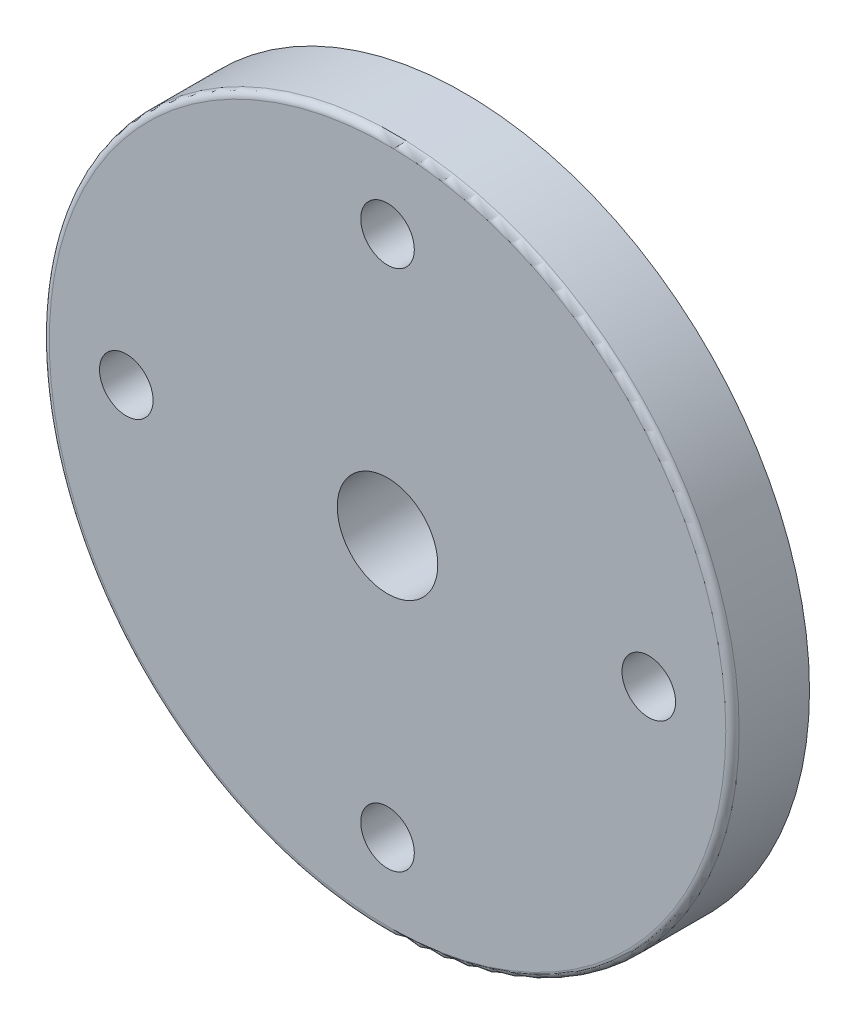
ISO-10303-21;
HEADER;
FILE_DESCRIPTION(('STEP AP214'),'2;1');
FILE_NAME('part.step','',(''),(''),'','','');
FILE_SCHEMA(('AUTOMOTIVE_DESIGN { 1 0 10303 214 1 1 1 1 }'));
ENDSEC;
DATA;
#1=APPLICATION_CONTEXT('core data for automotive mechanical design processes');
#2=APPLICATION_PROTOCOL_DEFINITION('international standard','automotive_design',2000,#1);
#3=PRODUCT_CONTEXT('',#1,'mechanical');
#4=PRODUCT('Part','Part','',(#3));
#5=PRODUCT_RELATED_PRODUCT_CATEGORY('part','',(#4));
#6=PRODUCT_DEFINITION_FORMATION('','',#4);
#7=PRODUCT_DEFINITION_CONTEXT('part definition',#1,'design');
#8=PRODUCT_DEFINITION('design','',#6,#7);
#9=PRODUCT_DEFINITION_SHAPE('','',#8);
#10=(LENGTH_UNIT() NAMED_UNIT(*) SI_UNIT(.MILLI.,.METRE.));
#11=(NAMED_UNIT(*) PLANE_ANGLE_UNIT() SI_UNIT($,.RADIAN.));
#12=(NAMED_UNIT(*) SI_UNIT($,.STERADIAN.) SOLID_ANGLE_UNIT());
#13=UNCERTAINTY_MEASURE_WITH_UNIT(LENGTH_MEASURE(1.E-05),#10,'distance_accuracy_value','');
#14=(GEOMETRIC_REPRESENTATION_CONTEXT(3) GLOBAL_UNCERTAINTY_ASSIGNED_CONTEXT((#13)) GLOBAL_UNIT_ASSIGNED_CONTEXT((#10,
#11,#12)) REPRESENTATION_CONTEXT('',''));
#15=CARTESIAN_POINT('',(0.,0.,0.));
#16=DIRECTION('',(0.,0.,1.));
#17=DIRECTION('',(1.,0.,0.));
#18=AXIS2_PLACEMENT_3D('',#15,#16,#17);
#19=CARTESIAN_POINT('',(0.,0.,-0.2));
#20=DIRECTION('',(0.,0.,-1.));
#21=DIRECTION('',(-1.,0.,0.));
#22=AXIS2_PLACEMENT_3D('',#19,#20,#21);
#23=CYLINDRICAL_SURFACE('',#22,10.3);
#24=CARTESIAN_POINT('',(0.,0.,-0.4));
#25=DIRECTION('',(0.,0.,1.));
#26=DIRECTION('',(1.,0.,0.));
#27=AXIS2_PLACEMENT_3D('',#24,#25,#26);
#28=CIRCLE('',#27,10.3);
#29=CARTESIAN_POINT('',(10.3,0.,-0.4));
#30=VERTEX_POINT('',#29);
#31=EDGE_CURVE('E49',#30,#30,#28,.F.);
#32=ORIENTED_EDGE('',*,*,#31,.T.);
#33=EDGE_LOOP('',(#32));
#34=FACE_BOUND('',#33,.T.);
#35=CARTESIAN_POINT('',(0.,0.,-2.5));
#36=DIRECTION('',(0.,0.,-1.));
#37=DIRECTION('',(1.,0.,0.));
#38=AXIS2_PLACEMENT_3D('',#35,#36,#37);
#39=CIRCLE('',#38,10.3);
#40=CARTESIAN_POINT('',(10.3,0.,-2.5));
#41=VERTEX_POINT('',#40);
#42=EDGE_CURVE('E60',#41,#41,#39,.T.);
#43=ORIENTED_EDGE('',*,*,#42,.F.);
#44=EDGE_LOOP('',(#43));
#45=FACE_BOUND('',#44,.T.);
#46=ADVANCED_FACE('F34',(#34,#45),#23,.T.);
#47=CARTESIAN_POINT('',(0.,0.,-0.2));
#48=DIRECTION('',(0.,0.,1.));
#49=DIRECTION('',(1.,0.,0.));
#50=AXIS2_PLACEMENT_3D('',#47,#48,#49);
#51=PLANE('',#50);
#52=CARTESIAN_POINT('',(0.,0.,-0.2));
#53=DIRECTION('',(0.,0.,1.));
#54=DIRECTION('',(1.,0.,0.));
#55=AXIS2_PLACEMENT_3D('',#52,#53,#54);
#56=CIRCLE('',#55,10.1);
#57=CARTESIAN_POINT('',(10.1,0.,-0.2));
#58=VERTEX_POINT('',#57);
#59=EDGE_CURVE('E45',#58,#58,#56,.T.);
#60=ORIENTED_EDGE('',*,*,#59,.T.);
#61=EDGE_LOOP('',(#60));
#62=FACE_BOUND('',#61,.T.);
#63=CARTESIAN_POINT('',(0.,7.8,-0.2));
#64=DIRECTION('',(0.,0.,-1.));
#65=DIRECTION('',(1.,0.,0.));
#66=AXIS2_PLACEMENT_3D('',#63,#64,#65);
#67=CIRCLE('',#66,0.8);
#68=CARTESIAN_POINT('',(0.8,7.8,-0.2));
#69=VERTEX_POINT('',#68);
#70=EDGE_CURVE('E72',#69,#69,#67,.T.);
#71=ORIENTED_EDGE('',*,*,#70,.T.);
#72=EDGE_LOOP('',(#71));
#73=FACE_BOUND('',#72,.T.);
#74=CARTESIAN_POINT('',(-7.80000000000022,2.20734109053816E-13,-0.2));
#75=DIRECTION('',(0.,0.,-1.));
#76=DIRECTION('',(1.,0.,0.));
#77=AXIS2_PLACEMENT_3D('',#74,#75,#76);
#78=CIRCLE('',#77,0.800000000000174);
#79=CARTESIAN_POINT('',(-7.00000000000005,2.20734109053816E-13,-0.2));
#80=VERTEX_POINT('',#79);
#81=EDGE_CURVE('E88',#80,#80,#78,.T.);
#82=ORIENTED_EDGE('',*,*,#81,.T.);
#83=EDGE_LOOP('',(#82));
#84=FACE_BOUND('',#83,.T.);
#85=CARTESIAN_POINT('',(-4.41468218107633E-13,-7.8,-0.2));
#86=DIRECTION('',(0.,0.,-1.));
#87=DIRECTION('',(1.,0.,0.));
#88=AXIS2_PLACEMENT_3D('',#85,#86,#87);
#89=CIRCLE('',#88,0.800000000000475);
#90=CARTESIAN_POINT('',(0.800000000000034,-7.8,-0.2));
#91=VERTEX_POINT('',#90);
#92=EDGE_CURVE('E82',#91,#91,#89,.T.);
#93=ORIENTED_EDGE('',*,*,#92,.T.);
#94=EDGE_LOOP('',(#93));
#95=FACE_BOUND('',#94,.T.);
#96=CARTESIAN_POINT('',(7.79999999999978,-2.21689333557151E-13,-0.2));
#97=DIRECTION('',(0.,0.,-1.));
#98=DIRECTION('',(1.,0.,0.));
#99=AXIS2_PLACEMENT_3D('',#96,#97,#98);
#100=CIRCLE('',#99,0.800000000000355);
#101=CARTESIAN_POINT('',(8.60000000000013,-2.21689333557151E-13,-0.2));
#102=VERTEX_POINT('',#101);
#103=EDGE_CURVE('E76',#102,#102,#100,.T.);
#104=ORIENTED_EDGE('',*,*,#103,.T.);
#105=EDGE_LOOP('',(#104));
#106=FACE_BOUND('',#105,.T.);
#107=CARTESIAN_POINT('',(0.,0.,-0.2));
#108=DIRECTION('',(0.,0.,1.));
#109=DIRECTION('',(-1.,0.,0.));
#110=AXIS2_PLACEMENT_3D('',#107,#108,#109);
#111=CIRCLE('',#110,1.5);
#112=CARTESIAN_POINT('',(-1.5,0.,-0.2));
#113=VERTEX_POINT('',#112);
#114=EDGE_CURVE('E59',#113,#113,#111,.T.);
#115=ORIENTED_EDGE('',*,*,#114,.F.);
#116=EDGE_LOOP('',(#115));
#117=FACE_BOUND('',#116,.T.);
#118=ADVANCED_FACE('F97',(#62,#73,#84,#95,#106,#117),#51,.T.);
#119=CARTESIAN_POINT('',(0.,0.,-2.5));
#120=DIRECTION('',(0.,0.,1.));
#121=DIRECTION('',(1.,0.,0.));
#122=AXIS2_PLACEMENT_3D('',#119,#120,#121);
#123=PLANE('',#122);
#124=CARTESIAN_POINT('',(0.,7.8,-2.5));
#125=DIRECTION('',(0.,0.,-1.));
#126=DIRECTION('',(1.,0.,0.));
#127=AXIS2_PLACEMENT_3D('',#124,#125,#126);
#128=CIRCLE('',#127,0.8);
#129=CARTESIAN_POINT('',(0.8,7.8,-2.5));
#130=VERTEX_POINT('',#129);
#131=EDGE_CURVE('E91',#130,#130,#128,.T.);
#132=ORIENTED_EDGE('',*,*,#131,.F.);
#133=EDGE_LOOP('',(#132));
#134=FACE_BOUND('',#133,.T.);
#135=CARTESIAN_POINT('',(-7.80000000000022,2.20734109053816E-13,-2.5));
#136=DIRECTION('',(0.,0.,-1.));
#137=DIRECTION('',(1.,0.,0.));
#138=AXIS2_PLACEMENT_3D('',#135,#136,#137);
#139=CIRCLE('',#138,0.800000000000174);
#140=CARTESIAN_POINT('',(-7.00000000000005,2.20734109053816E-13,-2.5));
#141=VERTEX_POINT('',#140);
#142=EDGE_CURVE('E85',#141,#141,#139,.T.);
#143=ORIENTED_EDGE('',*,*,#142,.F.);
#144=EDGE_LOOP('',(#143));
#145=FACE_BOUND('',#144,.T.);
#146=CARTESIAN_POINT('',(-4.41468218107633E-13,-7.8,-2.5));
#147=DIRECTION('',(0.,0.,-1.));
#148=DIRECTION('',(1.,0.,0.));
#149=AXIS2_PLACEMENT_3D('',#146,#147,#148);
#150=CIRCLE('',#149,0.800000000000475);
#151=CARTESIAN_POINT('',(0.800000000000034,-7.8,-2.5));
#152=VERTEX_POINT('',#151);
#153=EDGE_CURVE('E79',#152,#152,#150,.T.);
#154=ORIENTED_EDGE('',*,*,#153,.F.);
#155=EDGE_LOOP('',(#154));
#156=FACE_BOUND('',#155,.T.);
#157=CARTESIAN_POINT('',(7.79999999999978,-2.21689333557151E-13,-2.5));
#158=DIRECTION('',(0.,0.,-1.));
#159=DIRECTION('',(1.,0.,0.));
#160=AXIS2_PLACEMENT_3D('',#157,#158,#159);
#161=CIRCLE('',#160,0.800000000000355);
#162=CARTESIAN_POINT('',(8.60000000000013,-2.21689333557151E-13,-2.5));
#163=VERTEX_POINT('',#162);
#164=EDGE_CURVE('E73',#163,#163,#161,.T.);
#165=ORIENTED_EDGE('',*,*,#164,.F.);
#166=EDGE_LOOP('',(#165));
#167=FACE_BOUND('',#166,.T.);
#168=CARTESIAN_POINT('',(0.,0.,-2.5));
#169=DIRECTION('',(0.,0.,-1.));
#170=DIRECTION('',(-1.,0.,0.));
#171=AXIS2_PLACEMENT_3D('',#168,#169,#170);
#172=CIRCLE('',#171,4.375);
#173=CARTESIAN_POINT('',(-4.375,0.,-2.5));
#174=VERTEX_POINT('',#173);
#175=EDGE_CURVE('E54',#174,#174,#172,.T.);
#176=ORIENTED_EDGE('',*,*,#175,.F.);
#177=EDGE_LOOP('',(#176));
#178=FACE_BOUND('',#177,.T.);
#179=ORIENTED_EDGE('',*,*,#42,.T.);
#180=EDGE_LOOP('',(#179));
#181=FACE_BOUND('',#180,.T.);
#182=ADVANCED_FACE('F108',(#134,#145,#156,#167,#178,#181),#123,.F.);
#183=CARTESIAN_POINT('',(0.,0.,-5.7));
#184=DIRECTION('',(0.,0.,1.));
#185=DIRECTION('',(1.,0.,0.));
#186=AXIS2_PLACEMENT_3D('',#183,#184,#185);
#187=CYLINDRICAL_SURFACE('',#186,4.375);
#188=CARTESIAN_POINT('',(0.,0.,-5.4));
#189=DIRECTION('',(0.,0.,-1.));
#190=DIRECTION('',(-1.,0.,0.));
#191=AXIS2_PLACEMENT_3D('',#188,#189,#190);
#192=CIRCLE('',#191,4.375);
#193=CARTESIAN_POINT('',(-4.375,0.,-5.4));
#194=VERTEX_POINT('',#193);
#195=EDGE_CURVE('E10',#194,#194,#192,.F.);
#196=ORIENTED_EDGE('',*,*,#195,.T.);
#197=EDGE_LOOP('',(#196));
#198=FACE_BOUND('',#197,.T.);
#199=ORIENTED_EDGE('',*,*,#175,.T.);
#200=EDGE_LOOP('',(#199));
#201=FACE_BOUND('',#200,.T.);
#202=ADVANCED_FACE('F111',(#198,#201),#187,.T.);
#203=CARTESIAN_POINT('',(0.,0.,-5.7));
#204=DIRECTION('',(0.,0.,-1.));
#205=DIRECTION('',(-1.,0.,0.));
#206=AXIS2_PLACEMENT_3D('',#203,#204,#205);
#207=PLANE('',#206);
#208=CARTESIAN_POINT('',(0.,0.,-5.7));
#209=DIRECTION('',(0.,0.,-1.));
#210=DIRECTION('',(-1.,0.,0.));
#211=AXIS2_PLACEMENT_3D('',#208,#209,#210);
#212=CIRCLE('',#211,4.075);
#213=CARTESIAN_POINT('',(-4.075,0.,-5.7));
#214=VERTEX_POINT('',#213);
#215=EDGE_CURVE('E41',#214,#214,#212,.T.);
#216=ORIENTED_EDGE('',*,*,#215,.T.);
#217=EDGE_LOOP('',(#216));
#218=FACE_BOUND('',#217,.T.);
#219=CARTESIAN_POINT('',(0.,0.,-5.7));
#220=DIRECTION('',(0.,0.,-1.));
#221=DIRECTION('',(1.,0.,0.));
#222=AXIS2_PLACEMENT_3D('',#219,#220,#221);
#223=CIRCLE('',#222,3.);
#224=CARTESIAN_POINT('',(3.,0.,-5.7));
#225=VERTEX_POINT('',#224);
#226=EDGE_CURVE('E58',#225,#225,#223,.T.);
#227=ORIENTED_EDGE('',*,*,#226,.F.);
#228=EDGE_LOOP('',(#227));
#229=FACE_BOUND('',#228,.T.);
#230=ADVANCED_FACE('F149',(#218,#229),#207,.T.);
#231=CARTESIAN_POINT('',(0.,0.,-2.95));
#232=DIRECTION('',(0.,0.,-1.));
#233=DIRECTION('',(-1.,0.,0.));
#234=AXIS2_PLACEMENT_3D('',#231,#232,#233);
#235=CYLINDRICAL_SURFACE('',#234,3.);
#236=CARTESIAN_POINT('',(0.,0.,-2.95));
#237=DIRECTION('',(0.,0.,-1.));
#238=DIRECTION('',(1.,0.,0.));
#239=AXIS2_PLACEMENT_3D('',#236,#237,#238);
#240=CIRCLE('',#239,3.);
#241=CARTESIAN_POINT('',(3.,0.,-2.95));
#242=VERTEX_POINT('',#241);
#243=EDGE_CURVE('E63',#242,#242,#240,.T.);
#244=ORIENTED_EDGE('',*,*,#243,.F.);
#245=EDGE_LOOP('',(#244));
#246=FACE_BOUND('',#245,.T.);
#247=ORIENTED_EDGE('',*,*,#226,.T.);
#248=EDGE_LOOP('',(#247));
#249=FACE_BOUND('',#248,.T.);
#250=ADVANCED_FACE('F154',(#246,#249),#235,.F.);
#251=CARTESIAN_POINT('',(0.,0.,-2.95));
#252=DIRECTION('',(0.,0.,1.));
#253=DIRECTION('',(1.,0.,0.));
#254=AXIS2_PLACEMENT_3D('',#251,#252,#253);
#255=PLANE('',#254);
#256=CARTESIAN_POINT('',(0.,0.,-2.95));
#257=DIRECTION('',(0.,0.,1.));
#258=DIRECTION('',(1.,0.,0.));
#259=AXIS2_PLACEMENT_3D('',#256,#257,#258);
#260=CIRCLE('',#259,1.5);
#261=CARTESIAN_POINT('',(1.5,0.,-2.95));
#262=VERTEX_POINT('',#261);
#263=EDGE_CURVE('E55',#262,#262,#260,.T.);
#264=ORIENTED_EDGE('',*,*,#263,.T.);
#265=EDGE_LOOP('',(#264));
#266=FACE_BOUND('',#265,.T.);
#267=ORIENTED_EDGE('',*,*,#243,.T.);
#268=EDGE_LOOP('',(#267));
#269=FACE_BOUND('',#268,.T.);
#270=ADVANCED_FACE('F228',(#266,#269),#255,.F.);
#271=CARTESIAN_POINT('',(0.,0.,-5.7));
#272=DIRECTION('',(0.,0.,1.));
#273=DIRECTION('',(1.,0.,0.));
#274=AXIS2_PLACEMENT_3D('',#271,#272,#273);
#275=CYLINDRICAL_SURFACE('',#274,1.5);
#276=ORIENTED_EDGE('',*,*,#114,.T.);
#277=EDGE_LOOP('',(#276));
#278=FACE_BOUND('',#277,.T.);
#279=ORIENTED_EDGE('',*,*,#263,.F.);
#280=EDGE_LOOP('',(#279));
#281=FACE_BOUND('',#280,.T.);
#282=ADVANCED_FACE('F213',(#278,#281),#275,.F.);
#283=CARTESIAN_POINT('',(7.79999999999978,-2.21689333557151E-13,-0.2));
#284=DIRECTION('',(0.,0.,-1.));
#285=DIRECTION('',(-1.,0.,0.));
#286=AXIS2_PLACEMENT_3D('',#283,#284,#285);
#287=CYLINDRICAL_SURFACE('',#286,0.800000000000355);
#288=ORIENTED_EDGE('',*,*,#103,.F.);
#289=EDGE_LOOP('',(#288));
#290=FACE_BOUND('',#289,.T.);
#291=ORIENTED_EDGE('',*,*,#164,.T.);
#292=EDGE_LOOP('',(#291));
#293=FACE_BOUND('',#292,.T.);
#294=ADVANCED_FACE('F203',(#290,#293),#287,.F.);
#295=CARTESIAN_POINT('',(-4.41468218107633E-13,-7.8,-0.2));
#296=DIRECTION('',(0.,0.,-1.));
#297=DIRECTION('',(-1.,0.,0.));
#298=AXIS2_PLACEMENT_3D('',#295,#296,#297);
#299=CYLINDRICAL_SURFACE('',#298,0.800000000000475);
#300=ORIENTED_EDGE('',*,*,#92,.F.);
#301=EDGE_LOOP('',(#300));
#302=FACE_BOUND('',#301,.T.);
#303=ORIENTED_EDGE('',*,*,#153,.T.);
#304=EDGE_LOOP('',(#303));
#305=FACE_BOUND('',#304,.T.);
#306=ADVANCED_FACE('F193',(#302,#305),#299,.F.);
#307=CARTESIAN_POINT('',(-7.80000000000022,2.20734109053816E-13,-0.2));
#308=DIRECTION('',(0.,0.,-1.));
#309=DIRECTION('',(-1.,0.,0.));
#310=AXIS2_PLACEMENT_3D('',#307,#308,#309);
#311=CYLINDRICAL_SURFACE('',#310,0.800000000000174);
#312=ORIENTED_EDGE('',*,*,#81,.F.);
#313=EDGE_LOOP('',(#312));
#314=FACE_BOUND('',#313,.T.);
#315=ORIENTED_EDGE('',*,*,#142,.T.);
#316=EDGE_LOOP('',(#315));
#317=FACE_BOUND('',#316,.T.);
#318=ADVANCED_FACE('F104',(#314,#317),#311,.F.);
#319=CARTESIAN_POINT('',(0.,7.8,-0.2));
#320=DIRECTION('',(0.,0.,-1.));
#321=DIRECTION('',(-1.,0.,0.));
#322=AXIS2_PLACEMENT_3D('',#319,#320,#321);
#323=CYLINDRICAL_SURFACE('',#322,0.8);
#324=ORIENTED_EDGE('',*,*,#70,.F.);
#325=EDGE_LOOP('',(#324));
#326=FACE_BOUND('',#325,.T.);
#327=ORIENTED_EDGE('',*,*,#131,.T.);
#328=EDGE_LOOP('',(#327));
#329=FACE_BOUND('',#328,.T.);
#330=ADVANCED_FACE('F100',(#326,#329),#323,.F.);
#331=CARTESIAN_POINT('',(0.,0.,-0.4));
#332=DIRECTION('',(0.,0.,1.));
#333=DIRECTION('',(1.,0.,0.));
#334=AXIS2_PLACEMENT_3D('',#331,#332,#333);
#335=TOROIDAL_SURFACE('',#334,10.1,0.2);
#336=ORIENTED_EDGE('',*,*,#59,.F.);
#337=EDGE_LOOP('',(#336));
#338=FACE_BOUND('',#337,.T.);
#339=ORIENTED_EDGE('',*,*,#31,.F.);
#340=EDGE_LOOP('',(#339));
#341=FACE_BOUND('',#340,.T.);
#342=ADVANCED_FACE('F103',(#338,#341),#335,.T.);
#343=CARTESIAN_POINT('',(0.,0.,-5.4));
#344=DIRECTION('',(0.,0.,-1.));
#345=DIRECTION('',(-1.,0.,0.));
#346=AXIS2_PLACEMENT_3D('',#343,#344,#345);
#347=TOROIDAL_SURFACE('',#346,4.075,0.3);
#348=ORIENTED_EDGE('',*,*,#195,.F.);
#349=EDGE_LOOP('',(#348));
#350=FACE_BOUND('',#349,.T.);
#351=ORIENTED_EDGE('',*,*,#215,.F.);
#352=EDGE_LOOP('',(#351));
#353=FACE_BOUND('',#352,.T.);
#354=ADVANCED_FACE('F36',(#350,#353),#347,.T.);
#355=CLOSED_SHELL('',(#46,#118,#182,#202,#230,#250,#270,#282,#294,#306,#318,#330,#342,#354));
#356=MANIFOLD_SOLID_BREP('B2',#355);
#357=ADVANCED_BREP_SHAPE_REPRESENTATION('',(#18,#356),#14);
#358=SHAPE_DEFINITION_REPRESENTATION(#9,#357);
ENDSEC;
END-ISO-10303-21;
